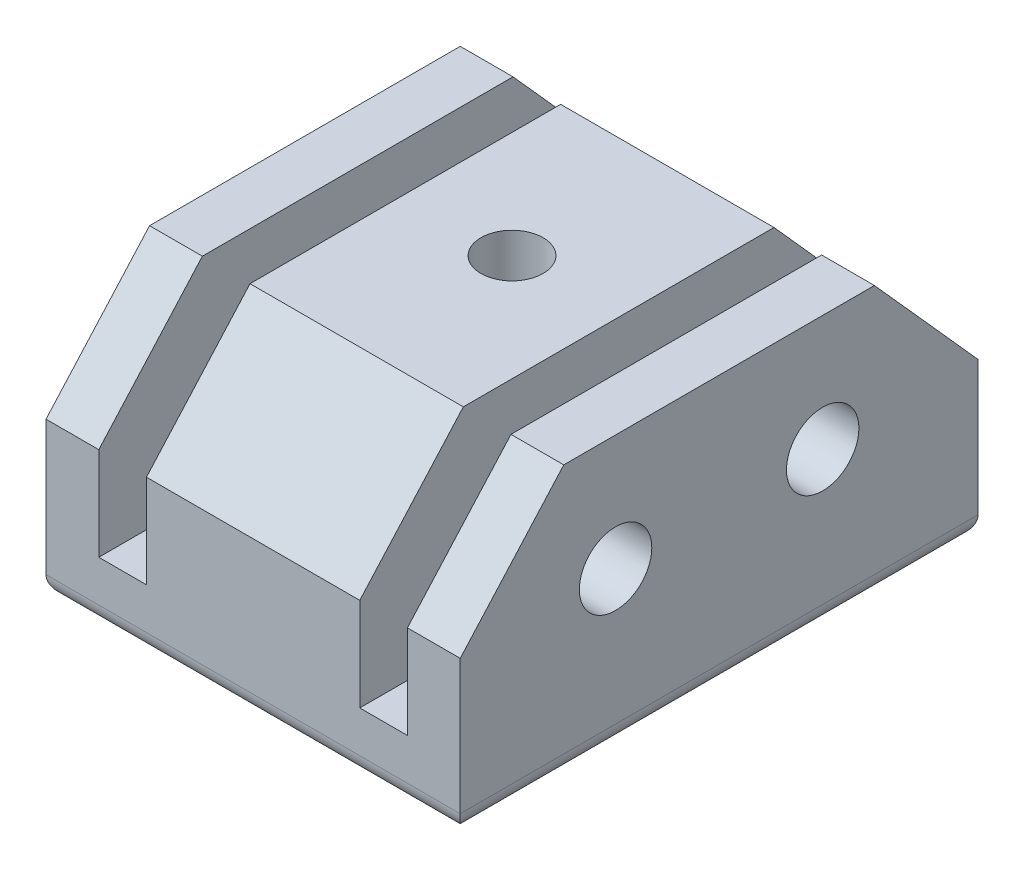
ISO-10303-21;
HEADER;
FILE_DESCRIPTION(('STEP AP214'),'2;1');
FILE_NAME('part.step','',(''),(''),'','','');
FILE_SCHEMA(('AUTOMOTIVE_DESIGN { 1 0 10303 214 1 1 1 1 }'));
ENDSEC;
DATA;
#1=APPLICATION_CONTEXT('core data for automotive mechanical design processes');
#2=APPLICATION_PROTOCOL_DEFINITION('international standard','automotive_design',2000,#1);
#3=PRODUCT_CONTEXT('',#1,'mechanical');
#4=PRODUCT('Part','Part','',(#3));
#5=PRODUCT_RELATED_PRODUCT_CATEGORY('part','',(#4));
#6=PRODUCT_DEFINITION_FORMATION('','',#4);
#7=PRODUCT_DEFINITION_CONTEXT('part definition',#1,'design');
#8=PRODUCT_DEFINITION('design','',#6,#7);
#9=PRODUCT_DEFINITION_SHAPE('','',#8);
#10=(LENGTH_UNIT() NAMED_UNIT(*) SI_UNIT(.MILLI.,.METRE.));
#11=(NAMED_UNIT(*) PLANE_ANGLE_UNIT() SI_UNIT($,.RADIAN.));
#12=(NAMED_UNIT(*) SI_UNIT($,.STERADIAN.) SOLID_ANGLE_UNIT());
#13=UNCERTAINTY_MEASURE_WITH_UNIT(LENGTH_MEASURE(1.E-05),#10,'distance_accuracy_value','');
#14=(GEOMETRIC_REPRESENTATION_CONTEXT(3) GLOBAL_UNCERTAINTY_ASSIGNED_CONTEXT((#13)) GLOBAL_UNIT_ASSIGNED_CONTEXT((#10,
#11,#12)) REPRESENTATION_CONTEXT('',''));
#15=CARTESIAN_POINT('',(0.,0.,0.));
#16=DIRECTION('',(0.,0.,1.));
#17=DIRECTION('',(1.,0.,0.));
#18=AXIS2_PLACEMENT_3D('',#15,#16,#17);
#19=CARTESIAN_POINT('',(-25.4,33.2490316571237,-31.75));
#20=DIRECTION('',(0.,-1.,0.));
#21=DIRECTION('',(0.,0.,-1.));
#22=AXIS2_PLACEMENT_3D('',#19,#20,#21);
#23=CYLINDRICAL_SURFACE('',#22,3.81);
#24=CARTESIAN_POINT('',(-25.4,33.2490316571237,-31.75));
#25=DIRECTION('',(0.,-1.,0.));
#26=DIRECTION('',(0.,0.,-1.));
#27=AXIS2_PLACEMENT_3D('',#24,#25,#26);
#28=CIRCLE('',#27,3.81);
#29=CARTESIAN_POINT('',(-25.4,33.2490316571237,-35.56));
#30=VERTEX_POINT('',#29);
#31=EDGE_CURVE('E272',#30,#30,#28,.T.);
#32=ORIENTED_EDGE('',*,*,#31,.F.);
#33=EDGE_LOOP('',(#32));
#34=FACE_BOUND('',#33,.T.);
#35=CARTESIAN_POINT('',(-25.4,6.35,-31.75));
#36=DIRECTION('',(0.,-1.,0.));
#37=DIRECTION('',(0.,0.,-1.));
#38=AXIS2_PLACEMENT_3D('',#35,#36,#37);
#39=CIRCLE('',#38,3.81);
#40=CARTESIAN_POINT('',(-25.4,6.35,-35.56));
#41=VERTEX_POINT('',#40);
#42=EDGE_CURVE('E47',#41,#41,#39,.F.);
#43=ORIENTED_EDGE('',*,*,#42,.F.);
#44=EDGE_LOOP('',(#43));
#45=FACE_BOUND('',#44,.T.);
#46=ADVANCED_FACE('F43',(#34,#45),#23,.F.);
#47=CARTESIAN_POINT('',(-50.8,19.05,0.));
#48=DIRECTION('',(0.,0.666666666666667,0.74535599249993));
#49=DIRECTION('',(0.,-0.74535599249993,0.666666666666667));
#50=AXIS2_PLACEMENT_3D('',#47,#48,#49);
#51=PLANE('',#50);
#52=DIRECTION('',(0.,-0.74535599249993,0.666666666666667));
#53=VECTOR('',#52,1.);
#54=CARTESIAN_POINT('',(-44.323,19.05,0.));
#55=LINE('',#54,#53);
#56=CARTESIAN_POINT('',(-44.323,33.2490316571237,-12.7));
#57=VERTEX_POINT('',#56);
#58=CARTESIAN_POINT('',(-44.323,19.05,0.));
#59=VERTEX_POINT('',#58);
#60=EDGE_CURVE('E367',#57,#59,#55,.T.);
#61=ORIENTED_EDGE('',*,*,#60,.F.);
#62=DIRECTION('',(1.,0.,0.));
#63=VECTOR('',#62,1.);
#64=CARTESIAN_POINT('',(-50.8,33.2490316571237,-12.7));
#65=LINE('',#64,#63);
#66=CARTESIAN_POINT('',(-50.8,33.2490316571237,-12.7));
#67=VERTEX_POINT('',#66);
#68=EDGE_CURVE('E394',#67,#57,#65,.T.);
#69=ORIENTED_EDGE('',*,*,#68,.F.);
#70=DIRECTION('',(0.,-0.74535599249993,0.666666666666667));
#71=VECTOR('',#70,1.);
#72=CARTESIAN_POINT('',(-50.8,19.05,0.));
#73=LINE('',#72,#71);
#74=CARTESIAN_POINT('',(-50.8,19.05,0.));
#75=VERTEX_POINT('',#74);
#76=EDGE_CURVE('E377',#67,#75,#73,.T.);
#77=ORIENTED_EDGE('',*,*,#76,.T.);
#78=DIRECTION('',(1.,0.,0.));
#79=VECTOR('',#78,1.);
#80=CARTESIAN_POINT('',(-50.8,19.05,0.));
#81=LINE('',#80,#79);
#82=EDGE_CURVE('E388',#75,#59,#81,.T.);
#83=ORIENTED_EDGE('',*,*,#82,.T.);
#84=EDGE_LOOP('',(#61,#69,#77,#83));
#85=FACE_BOUND('',#84,.T.);
#86=ADVANCED_FACE('F512',(#85),#51,.T.);
#87=DIRECTION('',(0.,0.74535599249993,-0.666666666666667));
#88=VECTOR('',#87,1.);
#89=CARTESIAN_POINT('',(-6.477,19.05,0.));
#90=LINE('',#89,#88);
#91=CARTESIAN_POINT('',(-6.477,19.05,0.));
#92=VERTEX_POINT('',#91);
#93=CARTESIAN_POINT('',(-6.477,33.2490316571237,-12.7));
#94=VERTEX_POINT('',#93);
#95=EDGE_CURVE('E363',#92,#94,#90,.T.);
#96=ORIENTED_EDGE('',*,*,#95,.F.);
#97=CARTESIAN_POINT('',(0.,19.05,0.));
#98=VERTEX_POINT('',#97);
#99=EDGE_CURVE('E393',#92,#98,#81,.T.);
#100=ORIENTED_EDGE('',*,*,#99,.T.);
#101=DIRECTION('',(0.,-0.74535599249993,0.666666666666667));
#102=VECTOR('',#101,1.);
#103=CARTESIAN_POINT('',(0.,19.05,0.));
#104=LINE('',#103,#102);
#105=CARTESIAN_POINT('',(0.,33.2490316571237,-12.7));
#106=VERTEX_POINT('',#105);
#107=EDGE_CURVE('E374',#106,#98,#104,.T.);
#108=ORIENTED_EDGE('',*,*,#107,.F.);
#109=EDGE_CURVE('E398',#94,#106,#65,.T.);
#110=ORIENTED_EDGE('',*,*,#109,.F.);
#111=EDGE_LOOP('',(#96,#100,#108,#110));
#112=FACE_BOUND('',#111,.T.);
#113=ADVANCED_FACE('F491',(#112),#51,.T.);
#114=CARTESIAN_POINT('',(-50.8,33.2490316571237,-12.7));
#115=DIRECTION('',(0.,1.,0.));
#116=DIRECTION('',(0.,0.,1.));
#117=AXIS2_PLACEMENT_3D('',#114,#115,#116);
#118=PLANE('',#117);
#119=DIRECTION('',(0.,0.,-1.));
#120=VECTOR('',#119,1.);
#121=CARTESIAN_POINT('',(-44.323,33.2490316571237,0.));
#122=LINE('',#121,#120);
#123=CARTESIAN_POINT('',(-44.323,33.2490316571237,-50.8));
#124=VERTEX_POINT('',#123);
#125=EDGE_CURVE('E320',#57,#124,#122,.T.);
#126=ORIENTED_EDGE('',*,*,#125,.T.);
#127=DIRECTION('',(1.,0.,0.));
#128=VECTOR('',#127,1.);
#129=CARTESIAN_POINT('',(-50.8,33.2490316571237,-50.8));
#130=LINE('',#129,#128);
#131=CARTESIAN_POINT('',(-50.8,33.2490316571237,-50.8));
#132=VERTEX_POINT('',#131);
#133=EDGE_CURVE('E399',#132,#124,#130,.T.);
#134=ORIENTED_EDGE('',*,*,#133,.F.);
#135=DIRECTION('',(0.,0.,1.));
#136=VECTOR('',#135,1.);
#137=CARTESIAN_POINT('',(-50.8,33.2490316571237,-12.7));
#138=LINE('',#137,#136);
#139=EDGE_CURVE('E373',#132,#67,#138,.T.);
#140=ORIENTED_EDGE('',*,*,#139,.T.);
#141=ORIENTED_EDGE('',*,*,#68,.T.);
#142=EDGE_LOOP('',(#126,#134,#140,#141));
#143=FACE_BOUND('',#142,.T.);
#144=ADVANCED_FACE('F510',(#143),#118,.T.);
#145=DIRECTION('',(0.,0.,-1.));
#146=VECTOR('',#145,1.);
#147=CARTESIAN_POINT('',(-6.477,33.2490316571237,0.));
#148=LINE('',#147,#146);
#149=CARTESIAN_POINT('',(-6.477,33.2490316571237,-50.8));
#150=VERTEX_POINT('',#149);
#151=EDGE_CURVE('E324',#94,#150,#148,.T.);
#152=ORIENTED_EDGE('',*,*,#151,.F.);
#153=ORIENTED_EDGE('',*,*,#109,.T.);
#154=DIRECTION('',(0.,0.,1.));
#155=VECTOR('',#154,1.);
#156=CARTESIAN_POINT('',(0.,33.2490316571237,-12.7));
#157=LINE('',#156,#155);
#158=CARTESIAN_POINT('',(0.,33.2490316571237,-50.8));
#159=VERTEX_POINT('',#158);
#160=EDGE_CURVE('E383',#159,#106,#157,.T.);
#161=ORIENTED_EDGE('',*,*,#160,.F.);
#162=EDGE_CURVE('E403',#150,#159,#130,.T.);
#163=ORIENTED_EDGE('',*,*,#162,.F.);
#164=EDGE_LOOP('',(#152,#153,#161,#163));
#165=FACE_BOUND('',#164,.T.);
#166=ADVANCED_FACE('F487',(#165),#118,.T.);
#167=CARTESIAN_POINT('',(-50.8,33.2490316571237,-50.8));
#168=DIRECTION('',(0.,0.666666666666666,-0.74535599249993));
#169=DIRECTION('',(0.,0.74535599249993,0.666666666666666));
#170=AXIS2_PLACEMENT_3D('',#167,#168,#169);
#171=PLANE('',#170);
#172=DIRECTION('',(0.,0.74535599249993,0.666666666666666));
#173=VECTOR('',#172,1.);
#174=CARTESIAN_POINT('',(-44.323,33.2490316571237,-50.8));
#175=LINE('',#174,#173);
#176=CARTESIAN_POINT('',(-44.323,19.05,-63.5));
#177=VERTEX_POINT('',#176);
#178=EDGE_CURVE('E423',#177,#124,#175,.T.);
#179=ORIENTED_EDGE('',*,*,#178,.F.);
#180=DIRECTION('',(1.,0.,0.));
#181=VECTOR('',#180,1.);
#182=CARTESIAN_POINT('',(-50.8,19.05,-63.5));
#183=LINE('',#182,#181);
#184=CARTESIAN_POINT('',(-50.8,19.05,-63.5));
#185=VERTEX_POINT('',#184);
#186=EDGE_CURVE('E404',#185,#177,#183,.T.);
#187=ORIENTED_EDGE('',*,*,#186,.F.);
#188=DIRECTION('',(0.,0.74535599249993,0.666666666666666));
#189=VECTOR('',#188,1.);
#190=CARTESIAN_POINT('',(-50.8,33.2490316571237,-50.8));
#191=LINE('',#190,#189);
#192=EDGE_CURVE('E370',#185,#132,#191,.T.);
#193=ORIENTED_EDGE('',*,*,#192,.T.);
#194=ORIENTED_EDGE('',*,*,#133,.T.);
#195=EDGE_LOOP('',(#179,#187,#193,#194));
#196=FACE_BOUND('',#195,.T.);
#197=ADVANCED_FACE('F505',(#196),#171,.T.);
#198=DIRECTION('',(0.,-0.74535599249993,-0.666666666666666));
#199=VECTOR('',#198,1.);
#200=CARTESIAN_POINT('',(-6.477,33.2490316571237,-50.8));
#201=LINE('',#200,#199);
#202=CARTESIAN_POINT('',(-6.477,19.05,-63.5));
#203=VERTEX_POINT('',#202);
#204=EDGE_CURVE('E419',#150,#203,#201,.T.);
#205=ORIENTED_EDGE('',*,*,#204,.F.);
#206=ORIENTED_EDGE('',*,*,#162,.T.);
#207=DIRECTION('',(0.,0.74535599249993,0.666666666666666));
#208=VECTOR('',#207,1.);
#209=CARTESIAN_POINT('',(0.,33.2490316571237,-50.8));
#210=LINE('',#209,#208);
#211=CARTESIAN_POINT('',(0.,19.05,-63.5));
#212=VERTEX_POINT('',#211);
#213=EDGE_CURVE('E369',#212,#159,#210,.T.);
#214=ORIENTED_EDGE('',*,*,#213,.F.);
#215=EDGE_CURVE('E380',#203,#212,#183,.T.);
#216=ORIENTED_EDGE('',*,*,#215,.F.);
#217=EDGE_LOOP('',(#205,#206,#214,#216));
#218=FACE_BOUND('',#217,.T.);
#219=ADVANCED_FACE('F481',(#218),#171,.T.);
#220=CARTESIAN_POINT('',(-50.8,0.,0.));
#221=DIRECTION('',(0.,0.,1.));
#222=DIRECTION('',(1.,0.,0.));
#223=AXIS2_PLACEMENT_3D('',#220,#221,#222);
#224=PLANE('',#223);
#225=DIRECTION('',(0.,-1.,0.));
#226=VECTOR('',#225,1.);
#227=CARTESIAN_POINT('',(-50.8,0.,0.));
#228=LINE('',#227,#226);
#229=CARTESIAN_POINT('',(-50.8,2.54,0.));
#230=VERTEX_POINT('',#229);
#231=EDGE_CURVE('E408',#75,#230,#228,.T.);
#232=ORIENTED_EDGE('',*,*,#231,.T.);
#233=DIRECTION('',(1.,0.,0.));
#234=VECTOR('',#233,1.);
#235=CARTESIAN_POINT('',(-50.8,2.54,0.));
#236=LINE('',#235,#234);
#237=CARTESIAN_POINT('',(0.,2.54,0.));
#238=VERTEX_POINT('',#237);
#239=EDGE_CURVE('E52',#230,#238,#236,.T.);
#240=ORIENTED_EDGE('',*,*,#239,.T.);
#241=DIRECTION('',(0.,-1.,0.));
#242=VECTOR('',#241,1.);
#243=CARTESIAN_POINT('',(0.,0.,0.));
#244=LINE('',#243,#242);
#245=EDGE_CURVE('E391',#98,#238,#244,.T.);
#246=ORIENTED_EDGE('',*,*,#245,.F.);
#247=ORIENTED_EDGE('',*,*,#99,.F.);
#248=DIRECTION('',(0.,-1.,0.));
#249=VECTOR('',#248,1.);
#250=CARTESIAN_POINT('',(-6.477,7.61999999999999,0.));
#251=LINE('',#250,#249);
#252=CARTESIAN_POINT('',(-6.477,7.61999999999999,0.));
#253=VERTEX_POINT('',#252);
#254=EDGE_CURVE('E338',#92,#253,#251,.T.);
#255=ORIENTED_EDGE('',*,*,#254,.T.);
#256=DIRECTION('',(-1.,0.,0.));
#257=VECTOR('',#256,1.);
#258=CARTESIAN_POINT('',(-12.319,7.61999999999999,0.));
#259=LINE('',#258,#257);
#260=CARTESIAN_POINT('',(-12.319,7.61999999999999,0.));
#261=VERTEX_POINT('',#260);
#262=EDGE_CURVE('E341',#253,#261,#259,.T.);
#263=ORIENTED_EDGE('',*,*,#262,.T.);
#264=DIRECTION('',(0.,1.,0.));
#265=VECTOR('',#264,1.);
#266=CARTESIAN_POINT('',(-12.319,7.61999999999999,0.));
#267=LINE('',#266,#265);
#268=CARTESIAN_POINT('',(-12.319,19.05,0.));
#269=VERTEX_POINT('',#268);
#270=EDGE_CURVE('E345',#261,#269,#267,.T.);
#271=ORIENTED_EDGE('',*,*,#270,.T.);
#272=CARTESIAN_POINT('',(-38.481,19.05,0.));
#273=VERTEX_POINT('',#272);
#274=EDGE_CURVE('E392',#273,#269,#81,.T.);
#275=ORIENTED_EDGE('',*,*,#274,.F.);
#276=DIRECTION('',(0.,-1.,0.));
#277=VECTOR('',#276,1.);
#278=CARTESIAN_POINT('',(-38.481,7.61999999999999,0.));
#279=LINE('',#278,#277);
#280=CARTESIAN_POINT('',(-38.481,7.61999999999999,0.));
#281=VERTEX_POINT('',#280);
#282=EDGE_CURVE('E313',#273,#281,#279,.T.);
#283=ORIENTED_EDGE('',*,*,#282,.T.);
#284=DIRECTION('',(-1.,0.,0.));
#285=VECTOR('',#284,1.);
#286=CARTESIAN_POINT('',(-38.481,7.61999999999999,0.));
#287=LINE('',#286,#285);
#288=CARTESIAN_POINT('',(-44.323,7.61999999999999,0.));
#289=VERTEX_POINT('',#288);
#290=EDGE_CURVE('E317',#281,#289,#287,.T.);
#291=ORIENTED_EDGE('',*,*,#290,.T.);
#292=DIRECTION('',(0.,1.,0.));
#293=VECTOR('',#292,1.);
#294=CARTESIAN_POINT('',(-44.323,7.61999999999999,0.));
#295=LINE('',#294,#293);
#296=EDGE_CURVE('E310',#289,#59,#295,.T.);
#297=ORIENTED_EDGE('',*,*,#296,.T.);
#298=ORIENTED_EDGE('',*,*,#82,.F.);
#299=EDGE_LOOP('',(#232,#240,#246,#247,#255,#263,#271,#275,#283,#291,#297,#298));
#300=FACE_BOUND('',#299,.T.);
#301=ADVANCED_FACE('F494',(#300),#224,.T.);
#302=CARTESIAN_POINT('',(-50.8,0.,-63.5));
#303=DIRECTION('',(0.,0.,-1.));
#304=DIRECTION('',(-1.,0.,0.));
#305=AXIS2_PLACEMENT_3D('',#302,#303,#304);
#306=PLANE('',#305);
#307=DIRECTION('',(0.,1.,0.));
#308=VECTOR('',#307,1.);
#309=CARTESIAN_POINT('',(0.,0.,-63.5));
#310=LINE('',#309,#308);
#311=CARTESIAN_POINT('',(0.,2.54,-63.5));
#312=VERTEX_POINT('',#311);
#313=EDGE_CURVE('E412',#312,#212,#310,.T.);
#314=ORIENTED_EDGE('',*,*,#313,.F.);
#315=DIRECTION('',(1.,0.,0.));
#316=VECTOR('',#315,1.);
#317=CARTESIAN_POINT('',(-50.8,2.54,-63.5));
#318=LINE('',#317,#316);
#319=CARTESIAN_POINT('',(-50.8,2.54,-63.5));
#320=VERTEX_POINT('',#319);
#321=EDGE_CURVE('E12',#312,#320,#318,.F.);
#322=ORIENTED_EDGE('',*,*,#321,.T.);
#323=DIRECTION('',(0.,1.,0.));
#324=VECTOR('',#323,1.);
#325=CARTESIAN_POINT('',(-50.8,0.,-63.5));
#326=LINE('',#325,#324);
#327=EDGE_CURVE('E411',#320,#185,#326,.T.);
#328=ORIENTED_EDGE('',*,*,#327,.T.);
#329=ORIENTED_EDGE('',*,*,#186,.T.);
#330=DIRECTION('',(0.,1.,0.));
#331=VECTOR('',#330,1.);
#332=CARTESIAN_POINT('',(-44.323,7.61999999999999,-63.5));
#333=LINE('',#332,#331);
#334=CARTESIAN_POINT('',(-44.323,7.61999999999999,-63.5));
#335=VERTEX_POINT('',#334);
#336=EDGE_CURVE('E321',#335,#177,#333,.T.);
#337=ORIENTED_EDGE('',*,*,#336,.F.);
#338=DIRECTION('',(-1.,0.,0.));
#339=VECTOR('',#338,1.);
#340=CARTESIAN_POINT('',(-38.481,7.61999999999999,-63.5));
#341=LINE('',#340,#339);
#342=CARTESIAN_POINT('',(-38.481,7.61999999999999,-63.5));
#343=VERTEX_POINT('',#342);
#344=EDGE_CURVE('E314',#343,#335,#341,.T.);
#345=ORIENTED_EDGE('',*,*,#344,.F.);
#346=DIRECTION('',(0.,-1.,0.));
#347=VECTOR('',#346,1.);
#348=CARTESIAN_POINT('',(-38.481,7.61999999999999,-63.5));
#349=LINE('',#348,#347);
#350=CARTESIAN_POINT('',(-38.481,19.05,-63.5));
#351=VERTEX_POINT('',#350);
#352=EDGE_CURVE('E323',#351,#343,#349,.T.);
#353=ORIENTED_EDGE('',*,*,#352,.F.);
#354=CARTESIAN_POINT('',(-12.319,19.05,-63.5));
#355=VERTEX_POINT('',#354);
#356=EDGE_CURVE('E407',#351,#355,#183,.T.);
#357=ORIENTED_EDGE('',*,*,#356,.T.);
#358=DIRECTION('',(0.,1.,0.));
#359=VECTOR('',#358,1.);
#360=CARTESIAN_POINT('',(-12.319,7.61999999999999,-63.5));
#361=LINE('',#360,#359);
#362=CARTESIAN_POINT('',(-12.319,7.61999999999999,-63.5));
#363=VERTEX_POINT('',#362);
#364=EDGE_CURVE('E342',#363,#355,#361,.T.);
#365=ORIENTED_EDGE('',*,*,#364,.F.);
#366=DIRECTION('',(-1.,0.,0.));
#367=VECTOR('',#366,1.);
#368=CARTESIAN_POINT('',(-12.319,7.61999999999999,-63.5));
#369=LINE('',#368,#367);
#370=CARTESIAN_POINT('',(-6.477,7.61999999999999,-63.5));
#371=VERTEX_POINT('',#370);
#372=EDGE_CURVE('E350',#371,#363,#369,.T.);
#373=ORIENTED_EDGE('',*,*,#372,.F.);
#374=DIRECTION('',(0.,-1.,0.));
#375=VECTOR('',#374,1.);
#376=CARTESIAN_POINT('',(-6.477,7.61999999999999,-63.5));
#377=LINE('',#376,#375);
#378=EDGE_CURVE('E309',#203,#371,#377,.T.);
#379=ORIENTED_EDGE('',*,*,#378,.F.);
#380=ORIENTED_EDGE('',*,*,#215,.T.);
#381=EDGE_LOOP('',(#314,#322,#328,#329,#337,#345,#353,#357,#365,#373,#379,#380));
#382=FACE_BOUND('',#381,.T.);
#383=ADVANCED_FACE('F474',(#382),#306,.T.);
#384=CARTESIAN_POINT('',(-50.8,0.,0.));
#385=DIRECTION('',(0.,-1.,0.));
#386=DIRECTION('',(0.,0.,-1.));
#387=AXIS2_PLACEMENT_3D('',#384,#385,#386);
#388=PLANE('',#387);
#389=DIRECTION('',(-1.,0.,0.));
#390=VECTOR('',#389,1.);
#391=CARTESIAN_POINT('',(-21.4405318538975,0.,-24.892));
#392=LINE('',#391,#390);
#393=CARTESIAN_POINT('',(-21.4405318538975,0.,-24.892));
#394=VERTEX_POINT('',#393);
#395=CARTESIAN_POINT('',(-29.3594681461025,0.,-24.892));
#396=VERTEX_POINT('',#395);
#397=EDGE_CURVE('E60',#394,#396,#392,.T.);
#398=ORIENTED_EDGE('',*,*,#397,.F.);
#399=DIRECTION('',(-0.5,0.,0.866025403784439));
#400=VECTOR('',#399,1.);
#401=CARTESIAN_POINT('',(-17.4810637077951,0.,-31.75));
#402=LINE('',#401,#400);
#403=CARTESIAN_POINT('',(-17.4810637077951,0.,-31.75));
#404=VERTEX_POINT('',#403);
#405=EDGE_CURVE('E239',#404,#394,#402,.T.);
#406=ORIENTED_EDGE('',*,*,#405,.F.);
#407=DIRECTION('',(0.5,0.,0.866025403784438));
#408=VECTOR('',#407,1.);
#409=CARTESIAN_POINT('',(-21.4405318538975,0.,-38.608));
#410=LINE('',#409,#408);
#411=CARTESIAN_POINT('',(-21.4405318538975,0.,-38.608));
#412=VERTEX_POINT('',#411);
#413=EDGE_CURVE('E242',#412,#404,#410,.T.);
#414=ORIENTED_EDGE('',*,*,#413,.F.);
#415=DIRECTION('',(1.,0.,0.));
#416=VECTOR('',#415,1.);
#417=CARTESIAN_POINT('',(-29.3594681461025,0.,-38.608));
#418=LINE('',#417,#416);
#419=CARTESIAN_POINT('',(-29.3594681461025,0.,-38.608));
#420=VERTEX_POINT('',#419);
#421=EDGE_CURVE('E258',#420,#412,#418,.T.);
#422=ORIENTED_EDGE('',*,*,#421,.F.);
#423=DIRECTION('',(0.5,0.,-0.866025403784439));
#424=VECTOR('',#423,1.);
#425=CARTESIAN_POINT('',(-33.3189362922049,0.,-31.75));
#426=LINE('',#425,#424);
#427=CARTESIAN_POINT('',(-33.3189362922049,0.,-31.75));
#428=VERTEX_POINT('',#427);
#429=EDGE_CURVE('E255',#428,#420,#426,.T.);
#430=ORIENTED_EDGE('',*,*,#429,.F.);
#431=DIRECTION('',(-0.5,0.,-0.866025403784439));
#432=VECTOR('',#431,1.);
#433=CARTESIAN_POINT('',(-29.3594681461025,0.,-24.892));
#434=LINE('',#433,#432);
#435=EDGE_CURVE('E253',#396,#428,#434,.T.);
#436=ORIENTED_EDGE('',*,*,#435,.F.);
#437=EDGE_LOOP('',(#398,#406,#414,#422,#430,#436));
#438=FACE_BOUND('',#437,.T.);
#439=DIRECTION('',(0.,0.,-1.));
#440=VECTOR('',#439,1.);
#441=CARTESIAN_POINT('',(-2.54,0.,0.));
#442=LINE('',#441,#440);
#443=CARTESIAN_POINT('',(-2.54,0.,-60.96));
#444=VERTEX_POINT('',#443);
#445=CARTESIAN_POINT('',(-2.54,0.,-2.54));
#446=VERTEX_POINT('',#445);
#447=EDGE_CURVE('E436',#444,#446,#442,.F.);
#448=ORIENTED_EDGE('',*,*,#447,.T.);
#449=DIRECTION('',(1.,0.,0.));
#450=VECTOR('',#449,1.);
#451=CARTESIAN_POINT('',(-50.8,0.,-2.54));
#452=LINE('',#451,#450);
#453=CARTESIAN_POINT('',(-48.26,0.,-2.54));
#454=VERTEX_POINT('',#453);
#455=EDGE_CURVE('E439',#446,#454,#452,.F.);
#456=ORIENTED_EDGE('',*,*,#455,.T.);
#457=DIRECTION('',(0.,0.,-1.));
#458=VECTOR('',#457,1.);
#459=CARTESIAN_POINT('',(-48.26,0.,0.));
#460=LINE('',#459,#458);
#461=CARTESIAN_POINT('',(-48.26,0.,-60.96));
#462=VERTEX_POINT('',#461);
#463=EDGE_CURVE('E434',#454,#462,#460,.T.);
#464=ORIENTED_EDGE('',*,*,#463,.T.);
#465=DIRECTION('',(1.,0.,0.));
#466=VECTOR('',#465,1.);
#467=CARTESIAN_POINT('',(-50.8,0.,-60.96));
#468=LINE('',#467,#466);
#469=EDGE_CURVE('E432',#462,#444,#468,.T.);
#470=ORIENTED_EDGE('',*,*,#469,.T.);
#471=EDGE_LOOP('',(#448,#456,#464,#470));
#472=FACE_BOUND('',#471,.T.);
#473=ADVANCED_FACE('F462',(#438,#472),#388,.T.);
#474=CARTESIAN_POINT('',(-50.8,0.,0.));
#475=DIRECTION('',(-1.,0.,0.));
#476=DIRECTION('',(0.,0.,1.));
#477=AXIS2_PLACEMENT_3D('',#474,#475,#476);
#478=PLANE('',#477);
#479=CARTESIAN_POINT('',(-50.8,19.05,-19.05));
#480=DIRECTION('',(1.,0.,0.));
#481=DIRECTION('',(0.,0.,-1.));
#482=AXIS2_PLACEMENT_3D('',#479,#480,#481);
#483=CIRCLE('',#482,4.445);
#484=CARTESIAN_POINT('',(-50.8,19.05,-23.495));
#485=VERTEX_POINT('',#484);
#486=EDGE_CURVE('E276',#485,#485,#483,.T.);
#487=ORIENTED_EDGE('',*,*,#486,.T.);
#488=EDGE_LOOP('',(#487));
#489=FACE_BOUND('',#488,.T.);
#490=CARTESIAN_POINT('',(-50.8,19.05,-44.45));
#491=DIRECTION('',(1.,0.,0.));
#492=DIRECTION('',(0.,0.,-1.));
#493=AXIS2_PLACEMENT_3D('',#490,#491,#492);
#494=CIRCLE('',#493,4.44499999999999);
#495=CARTESIAN_POINT('',(-50.8,19.05,-48.895));
#496=VERTEX_POINT('',#495);
#497=EDGE_CURVE('E283',#496,#496,#494,.T.);
#498=ORIENTED_EDGE('',*,*,#497,.T.);
#499=EDGE_LOOP('',(#498));
#500=FACE_BOUND('',#499,.T.);
#501=ORIENTED_EDGE('',*,*,#327,.F.);
#502=DIRECTION('',(0.,0.,-1.));
#503=VECTOR('',#502,1.);
#504=CARTESIAN_POINT('',(-50.8,2.54,0.));
#505=LINE('',#504,#503);
#506=EDGE_CURVE('E441',#320,#230,#505,.F.);
#507=ORIENTED_EDGE('',*,*,#506,.T.);
#508=ORIENTED_EDGE('',*,*,#231,.F.);
#509=ORIENTED_EDGE('',*,*,#76,.F.);
#510=ORIENTED_EDGE('',*,*,#139,.F.);
#511=ORIENTED_EDGE('',*,*,#192,.F.);
#512=EDGE_LOOP('',(#501,#507,#508,#509,#510,#511));
#513=FACE_BOUND('',#512,.T.);
#514=ADVANCED_FACE('F498',(#489,#500,#513),#478,.T.);
#515=CARTESIAN_POINT('',(0.,0.,0.));
#516=DIRECTION('',(-1.,0.,0.));
#517=DIRECTION('',(0.,0.,1.));
#518=AXIS2_PLACEMENT_3D('',#515,#516,#517);
#519=PLANE('',#518);
#520=CARTESIAN_POINT('',(0.,19.05,-19.05));
#521=DIRECTION('',(1.,0.,0.));
#522=DIRECTION('',(0.,0.,-1.));
#523=AXIS2_PLACEMENT_3D('',#520,#521,#522);
#524=CIRCLE('',#523,4.445);
#525=CARTESIAN_POINT('',(0.,19.05,-23.495));
#526=VERTEX_POINT('',#525);
#527=EDGE_CURVE('E280',#526,#526,#524,.T.);
#528=ORIENTED_EDGE('',*,*,#527,.F.);
#529=EDGE_LOOP('',(#528));
#530=FACE_BOUND('',#529,.T.);
#531=CARTESIAN_POINT('',(0.,19.05,-44.45));
#532=DIRECTION('',(1.,0.,0.));
#533=DIRECTION('',(0.,0.,-1.));
#534=AXIS2_PLACEMENT_3D('',#531,#532,#533);
#535=CIRCLE('',#534,4.44499999999999);
#536=CARTESIAN_POINT('',(0.,19.05,-48.895));
#537=VERTEX_POINT('',#536);
#538=EDGE_CURVE('E286',#537,#537,#535,.T.);
#539=ORIENTED_EDGE('',*,*,#538,.F.);
#540=EDGE_LOOP('',(#539));
#541=FACE_BOUND('',#540,.T.);
#542=ORIENTED_EDGE('',*,*,#245,.T.);
#543=DIRECTION('',(0.,0.,-1.));
#544=VECTOR('',#543,1.);
#545=CARTESIAN_POINT('',(0.,2.54,-63.5));
#546=LINE('',#545,#544);
#547=EDGE_CURVE('E425',#238,#312,#546,.T.);
#548=ORIENTED_EDGE('',*,*,#547,.T.);
#549=ORIENTED_EDGE('',*,*,#313,.T.);
#550=ORIENTED_EDGE('',*,*,#213,.T.);
#551=ORIENTED_EDGE('',*,*,#160,.T.);
#552=ORIENTED_EDGE('',*,*,#107,.T.);
#553=EDGE_LOOP('',(#542,#548,#549,#550,#551,#552));
#554=FACE_BOUND('',#553,.T.);
#555=ADVANCED_FACE('F471',(#530,#541,#554),#519,.F.);
#556=DIRECTION('',(0.,0.74535599249993,-0.666666666666667));
#557=VECTOR('',#556,1.);
#558=CARTESIAN_POINT('',(-38.481,19.05,0.));
#559=LINE('',#558,#557);
#560=CARTESIAN_POINT('',(-38.481,33.2490316571237,-12.7));
#561=VERTEX_POINT('',#560);
#562=EDGE_CURVE('E365',#273,#561,#559,.T.);
#563=ORIENTED_EDGE('',*,*,#562,.F.);
#564=ORIENTED_EDGE('',*,*,#274,.T.);
#565=DIRECTION('',(0.,-0.74535599249993,0.666666666666667));
#566=VECTOR('',#565,1.);
#567=CARTESIAN_POINT('',(-12.319,19.05,0.));
#568=LINE('',#567,#566);
#569=CARTESIAN_POINT('',(-12.319,33.2490316571237,-12.7));
#570=VERTEX_POINT('',#569);
#571=EDGE_CURVE('E330',#570,#269,#568,.T.);
#572=ORIENTED_EDGE('',*,*,#571,.F.);
#573=EDGE_CURVE('E397',#561,#570,#65,.T.);
#574=ORIENTED_EDGE('',*,*,#573,.F.);
#575=EDGE_LOOP('',(#563,#564,#572,#574));
#576=FACE_BOUND('',#575,.T.);
#577=ADVANCED_FACE('F540',(#576),#51,.T.);
#578=ORIENTED_EDGE('',*,*,#31,.T.);
#579=EDGE_LOOP('',(#578));
#580=FACE_BOUND('',#579,.T.);
#581=DIRECTION('',(0.,0.,-1.));
#582=VECTOR('',#581,1.);
#583=CARTESIAN_POINT('',(-38.481,33.2490316571237,0.));
#584=LINE('',#583,#582);
#585=CARTESIAN_POINT('',(-38.481,33.2490316571237,-50.8));
#586=VERTEX_POINT('',#585);
#587=EDGE_CURVE('E334',#561,#586,#584,.T.);
#588=ORIENTED_EDGE('',*,*,#587,.F.);
#589=ORIENTED_EDGE('',*,*,#573,.T.);
#590=DIRECTION('',(0.,0.,-1.));
#591=VECTOR('',#590,1.);
#592=CARTESIAN_POINT('',(-12.319,33.2490316571237,0.));
#593=LINE('',#592,#591);
#594=CARTESIAN_POINT('',(-12.319,33.2490316571237,-50.8));
#595=VERTEX_POINT('',#594);
#596=EDGE_CURVE('E355',#570,#595,#593,.T.);
#597=ORIENTED_EDGE('',*,*,#596,.T.);
#598=EDGE_CURVE('E402',#586,#595,#130,.T.);
#599=ORIENTED_EDGE('',*,*,#598,.F.);
#600=EDGE_LOOP('',(#588,#589,#597,#599));
#601=FACE_BOUND('',#600,.T.);
#602=ADVANCED_FACE('F536',(#580,#601),#118,.T.);
#603=DIRECTION('',(0.,-0.74535599249993,-0.666666666666666));
#604=VECTOR('',#603,1.);
#605=CARTESIAN_POINT('',(-38.481,33.2490316571237,-50.8));
#606=LINE('',#605,#604);
#607=EDGE_CURVE('E421',#586,#351,#606,.T.);
#608=ORIENTED_EDGE('',*,*,#607,.F.);
#609=ORIENTED_EDGE('',*,*,#598,.T.);
#610=DIRECTION('',(0.,0.74535599249993,0.666666666666666));
#611=VECTOR('',#610,1.);
#612=CARTESIAN_POINT('',(-12.319,33.2490316571237,-50.8));
#613=LINE('',#612,#611);
#614=EDGE_CURVE('E414',#355,#595,#613,.T.);
#615=ORIENTED_EDGE('',*,*,#614,.F.);
#616=ORIENTED_EDGE('',*,*,#356,.F.);
#617=EDGE_LOOP('',(#608,#609,#615,#616));
#618=FACE_BOUND('',#617,.T.);
#619=ADVANCED_FACE('F527',(#618),#171,.T.);
#620=CARTESIAN_POINT('',(-6.477,7.61999999999999,0.));
#621=DIRECTION('',(1.,0.,0.));
#622=DIRECTION('',(0.,1.,0.));
#623=AXIS2_PLACEMENT_3D('',#620,#621,#622);
#624=PLANE('',#623);
#625=CARTESIAN_POINT('',(-6.477,19.05,-19.05));
#626=DIRECTION('',(1.,0.,0.));
#627=DIRECTION('',(0.,1.,0.));
#628=AXIS2_PLACEMENT_3D('',#625,#626,#627);
#629=CIRCLE('',#628,4.445);
#630=CARTESIAN_POINT('',(-6.477,23.495,-19.05));
#631=VERTEX_POINT('',#630);
#632=EDGE_CURVE('E306',#631,#631,#629,.T.);
#633=ORIENTED_EDGE('',*,*,#632,.T.);
#634=EDGE_LOOP('',(#633));
#635=FACE_BOUND('',#634,.T.);
#636=CARTESIAN_POINT('',(-6.477,19.05,-44.45));
#637=DIRECTION('',(1.,0.,0.));
#638=DIRECTION('',(0.,1.,0.));
#639=AXIS2_PLACEMENT_3D('',#636,#637,#638);
#640=CIRCLE('',#639,4.44499999999999);
#641=CARTESIAN_POINT('',(-6.477,23.495,-44.45));
#642=VERTEX_POINT('',#641);
#643=EDGE_CURVE('E296',#642,#642,#640,.T.);
#644=ORIENTED_EDGE('',*,*,#643,.T.);
#645=EDGE_LOOP('',(#644));
#646=FACE_BOUND('',#645,.T.);
#647=ORIENTED_EDGE('',*,*,#95,.T.);
#648=ORIENTED_EDGE('',*,*,#151,.T.);
#649=ORIENTED_EDGE('',*,*,#204,.T.);
#650=ORIENTED_EDGE('',*,*,#378,.T.);
#651=DIRECTION('',(0.,0.,-1.));
#652=VECTOR('',#651,1.);
#653=CARTESIAN_POINT('',(-6.477,7.61999999999999,0.));
#654=LINE('',#653,#652);
#655=EDGE_CURVE('E348',#253,#371,#654,.T.);
#656=ORIENTED_EDGE('',*,*,#655,.F.);
#657=ORIENTED_EDGE('',*,*,#254,.F.);
#658=EDGE_LOOP('',(#647,#648,#649,#650,#656,#657));
#659=FACE_BOUND('',#658,.T.);
#660=ADVANCED_FACE('F547',(#635,#646,#659),#624,.F.);
#661=CARTESIAN_POINT('',(-12.319,7.61999999999999,0.));
#662=DIRECTION('',(-1.,0.,0.));
#663=DIRECTION('',(0.,0.,1.));
#664=AXIS2_PLACEMENT_3D('',#661,#662,#663);
#665=PLANE('',#664);
#666=CARTESIAN_POINT('',(-12.319,19.05,-19.05));
#667=DIRECTION('',(-1.,0.,0.));
#668=DIRECTION('',(0.,0.,1.));
#669=AXIS2_PLACEMENT_3D('',#666,#667,#668);
#670=CIRCLE('',#669,4.445);
#671=CARTESIAN_POINT('',(-12.319,19.05,-14.605));
#672=VERTEX_POINT('',#671);
#673=EDGE_CURVE('E303',#672,#672,#670,.T.);
#674=ORIENTED_EDGE('',*,*,#673,.T.);
#675=EDGE_LOOP('',(#674));
#676=FACE_BOUND('',#675,.T.);
#677=CARTESIAN_POINT('',(-12.319,19.05,-44.45));
#678=DIRECTION('',(-1.,0.,0.));
#679=DIRECTION('',(0.,0.,1.));
#680=AXIS2_PLACEMENT_3D('',#677,#678,#679);
#681=CIRCLE('',#680,4.44499999999999);
#682=CARTESIAN_POINT('',(-12.319,19.05,-40.005));
#683=VERTEX_POINT('',#682);
#684=EDGE_CURVE('E293',#683,#683,#681,.T.);
#685=ORIENTED_EDGE('',*,*,#684,.T.);
#686=EDGE_LOOP('',(#685));
#687=FACE_BOUND('',#686,.T.);
#688=ORIENTED_EDGE('',*,*,#571,.T.);
#689=ORIENTED_EDGE('',*,*,#270,.F.);
#690=DIRECTION('',(0.,0.,-1.));
#691=VECTOR('',#690,1.);
#692=CARTESIAN_POINT('',(-12.319,7.61999999999999,0.));
#693=LINE('',#692,#691);
#694=EDGE_CURVE('E358',#261,#363,#693,.T.);
#695=ORIENTED_EDGE('',*,*,#694,.T.);
#696=ORIENTED_EDGE('',*,*,#364,.T.);
#697=ORIENTED_EDGE('',*,*,#614,.T.);
#698=ORIENTED_EDGE('',*,*,#596,.F.);
#699=EDGE_LOOP('',(#688,#689,#695,#696,#697,#698));
#700=FACE_BOUND('',#699,.T.);
#701=ADVANCED_FACE('F531',(#676,#687,#700),#665,.F.);
#702=CARTESIAN_POINT('',(-12.319,7.61999999999999,0.));
#703=DIRECTION('',(0.,-1.,0.));
#704=DIRECTION('',(1.,0.,0.));
#705=AXIS2_PLACEMENT_3D('',#702,#703,#704);
#706=PLANE('',#705);
#707=ORIENTED_EDGE('',*,*,#372,.T.);
#708=ORIENTED_EDGE('',*,*,#694,.F.);
#709=ORIENTED_EDGE('',*,*,#262,.F.);
#710=ORIENTED_EDGE('',*,*,#655,.T.);
#711=EDGE_LOOP('',(#707,#708,#709,#710));
#712=FACE_BOUND('',#711,.T.);
#713=ADVANCED_FACE('F545',(#712),#706,.F.);
#714=CARTESIAN_POINT('',(-44.323,7.61999999999999,0.));
#715=DIRECTION('',(-1.,0.,0.));
#716=DIRECTION('',(0.,0.,1.));
#717=AXIS2_PLACEMENT_3D('',#714,#715,#716);
#718=PLANE('',#717);
#719=CARTESIAN_POINT('',(-44.323,19.05,-19.05));
#720=DIRECTION('',(-1.,0.,0.));
#721=DIRECTION('',(0.,0.,1.));
#722=AXIS2_PLACEMENT_3D('',#719,#720,#721);
#723=CIRCLE('',#722,4.445);
#724=CARTESIAN_POINT('',(-44.323,19.05,-14.605));
#725=VERTEX_POINT('',#724);
#726=EDGE_CURVE('E300',#725,#725,#723,.T.);
#727=ORIENTED_EDGE('',*,*,#726,.T.);
#728=EDGE_LOOP('',(#727));
#729=FACE_BOUND('',#728,.T.);
#730=CARTESIAN_POINT('',(-44.323,19.05,-44.45));
#731=DIRECTION('',(-1.,0.,0.));
#732=DIRECTION('',(0.,0.,1.));
#733=AXIS2_PLACEMENT_3D('',#730,#731,#732);
#734=CIRCLE('',#733,4.44499999999999);
#735=CARTESIAN_POINT('',(-44.323,19.05,-40.005));
#736=VERTEX_POINT('',#735);
#737=EDGE_CURVE('E290',#736,#736,#734,.T.);
#738=ORIENTED_EDGE('',*,*,#737,.T.);
#739=EDGE_LOOP('',(#738));
#740=FACE_BOUND('',#739,.T.);
#741=ORIENTED_EDGE('',*,*,#60,.T.);
#742=ORIENTED_EDGE('',*,*,#296,.F.);
#743=DIRECTION('',(0.,0.,-1.));
#744=VECTOR('',#743,1.);
#745=CARTESIAN_POINT('',(-44.323,7.61999999999999,0.));
#746=LINE('',#745,#744);
#747=EDGE_CURVE('E328',#289,#335,#746,.T.);
#748=ORIENTED_EDGE('',*,*,#747,.T.);
#749=ORIENTED_EDGE('',*,*,#336,.T.);
#750=ORIENTED_EDGE('',*,*,#178,.T.);
#751=ORIENTED_EDGE('',*,*,#125,.F.);
#752=EDGE_LOOP('',(#741,#742,#748,#749,#750,#751));
#753=FACE_BOUND('',#752,.T.);
#754=ADVANCED_FACE('F507',(#729,#740,#753),#718,.F.);
#755=CARTESIAN_POINT('',(-38.481,7.61999999999999,0.));
#756=DIRECTION('',(0.,-1.,0.));
#757=DIRECTION('',(1.,0.,0.));
#758=AXIS2_PLACEMENT_3D('',#755,#756,#757);
#759=PLANE('',#758);
#760=ORIENTED_EDGE('',*,*,#344,.T.);
#761=ORIENTED_EDGE('',*,*,#747,.F.);
#762=ORIENTED_EDGE('',*,*,#290,.F.);
#763=DIRECTION('',(0.,0.,-1.));
#764=VECTOR('',#763,1.);
#765=CARTESIAN_POINT('',(-38.481,7.61999999999999,0.));
#766=LINE('',#765,#764);
#767=EDGE_CURVE('E331',#281,#343,#766,.T.);
#768=ORIENTED_EDGE('',*,*,#767,.T.);
#769=EDGE_LOOP('',(#760,#761,#762,#768));
#770=FACE_BOUND('',#769,.T.);
#771=ADVANCED_FACE('F517',(#770),#759,.F.);
#772=CARTESIAN_POINT('',(-38.481,7.61999999999999,0.));
#773=DIRECTION('',(1.,0.,0.));
#774=DIRECTION('',(0.,0.,-1.));
#775=AXIS2_PLACEMENT_3D('',#772,#773,#774);
#776=PLANE('',#775);
#777=CARTESIAN_POINT('',(-38.481,19.05,-19.05));
#778=DIRECTION('',(1.,0.,0.));
#779=DIRECTION('',(0.,0.,-1.));
#780=AXIS2_PLACEMENT_3D('',#777,#778,#779);
#781=CIRCLE('',#780,4.445);
#782=CARTESIAN_POINT('',(-38.481,19.05,-23.495));
#783=VERTEX_POINT('',#782);
#784=EDGE_CURVE('E299',#783,#783,#781,.T.);
#785=ORIENTED_EDGE('',*,*,#784,.T.);
#786=EDGE_LOOP('',(#785));
#787=FACE_BOUND('',#786,.T.);
#788=CARTESIAN_POINT('',(-38.481,19.05,-44.45));
#789=DIRECTION('',(1.,0.,0.));
#790=DIRECTION('',(0.,0.,-1.));
#791=AXIS2_PLACEMENT_3D('',#788,#789,#790);
#792=CIRCLE('',#791,4.44499999999999);
#793=CARTESIAN_POINT('',(-38.481,19.05,-48.895));
#794=VERTEX_POINT('',#793);
#795=EDGE_CURVE('E279',#794,#794,#792,.T.);
#796=ORIENTED_EDGE('',*,*,#795,.T.);
#797=EDGE_LOOP('',(#796));
#798=FACE_BOUND('',#797,.T.);
#799=ORIENTED_EDGE('',*,*,#562,.T.);
#800=ORIENTED_EDGE('',*,*,#587,.T.);
#801=ORIENTED_EDGE('',*,*,#607,.T.);
#802=ORIENTED_EDGE('',*,*,#352,.T.);
#803=ORIENTED_EDGE('',*,*,#767,.F.);
#804=ORIENTED_EDGE('',*,*,#282,.F.);
#805=EDGE_LOOP('',(#799,#800,#801,#802,#803,#804));
#806=FACE_BOUND('',#805,.T.);
#807=ADVANCED_FACE('F586',(#787,#798,#806),#776,.F.);
#808=CARTESIAN_POINT('',(-50.8,19.05,-44.45));
#809=DIRECTION('',(1.,0.,0.));
#810=DIRECTION('',(0.,0.,-1.));
#811=AXIS2_PLACEMENT_3D('',#808,#809,#810);
#812=CYLINDRICAL_SURFACE('',#811,4.44499999999999);
#813=ORIENTED_EDGE('',*,*,#795,.F.);
#814=EDGE_LOOP('',(#813));
#815=FACE_BOUND('',#814,.T.);
#816=ORIENTED_EDGE('',*,*,#684,.F.);
#817=EDGE_LOOP('',(#816));
#818=FACE_BOUND('',#817,.T.);
#819=ADVANCED_FACE('F582',(#815,#818),#812,.F.);
#820=CARTESIAN_POINT('',(-50.8,19.05,-19.05));
#821=DIRECTION('',(1.,0.,0.));
#822=DIRECTION('',(0.,0.,-1.));
#823=AXIS2_PLACEMENT_3D('',#820,#821,#822);
#824=CYLINDRICAL_SURFACE('',#823,4.445);
#825=ORIENTED_EDGE('',*,*,#784,.F.);
#826=EDGE_LOOP('',(#825));
#827=FACE_BOUND('',#826,.T.);
#828=ORIENTED_EDGE('',*,*,#673,.F.);
#829=EDGE_LOOP('',(#828));
#830=FACE_BOUND('',#829,.T.);
#831=ADVANCED_FACE('F577',(#827,#830),#824,.F.);
#832=ORIENTED_EDGE('',*,*,#497,.F.);
#833=EDGE_LOOP('',(#832));
#834=FACE_BOUND('',#833,.T.);
#835=ORIENTED_EDGE('',*,*,#737,.F.);
#836=EDGE_LOOP('',(#835));
#837=FACE_BOUND('',#836,.T.);
#838=ADVANCED_FACE('F583',(#834,#837),#812,.F.);
#839=ORIENTED_EDGE('',*,*,#486,.F.);
#840=EDGE_LOOP('',(#839));
#841=FACE_BOUND('',#840,.T.);
#842=ORIENTED_EDGE('',*,*,#726,.F.);
#843=EDGE_LOOP('',(#842));
#844=FACE_BOUND('',#843,.T.);
#845=ADVANCED_FACE('F578',(#841,#844),#824,.F.);
#846=ORIENTED_EDGE('',*,*,#538,.T.);
#847=EDGE_LOOP('',(#846));
#848=FACE_BOUND('',#847,.T.);
#849=ORIENTED_EDGE('',*,*,#643,.F.);
#850=EDGE_LOOP('',(#849));
#851=FACE_BOUND('',#850,.T.);
#852=ADVANCED_FACE('F575',(#848,#851),#812,.F.);
#853=ORIENTED_EDGE('',*,*,#527,.T.);
#854=EDGE_LOOP('',(#853));
#855=FACE_BOUND('',#854,.T.);
#856=ORIENTED_EDGE('',*,*,#632,.F.);
#857=EDGE_LOOP('',(#856));
#858=FACE_BOUND('',#857,.T.);
#859=ADVANCED_FACE('F572',(#855,#858),#824,.F.);
#860=CARTESIAN_POINT('',(-48.26,2.54,0.));
#861=DIRECTION('',(0.,0.,-1.));
#862=DIRECTION('',(-1.,0.,0.));
#863=AXIS2_PLACEMENT_3D('',#860,#861,#862);
#864=CYLINDRICAL_SURFACE('',#863,2.54);
#865=CARTESIAN_POINT('',(-48.26,2.54,-60.96));
#866=DIRECTION('',(0.707106781186547,0.,-0.707106781186547));
#867=DIRECTION('',(0.707106781186547,0.,0.707106781186547));
#868=AXIS2_PLACEMENT_3D('',#865,#866,#867);
#869=ELLIPSE('',#868,3.59210244842766,2.54);
#870=EDGE_CURVE('E447',#462,#320,#869,.T.);
#871=ORIENTED_EDGE('',*,*,#870,.F.);
#872=ORIENTED_EDGE('',*,*,#463,.F.);
#873=CARTESIAN_POINT('',(-48.26,2.54,-2.54));
#874=DIRECTION('',(0.707106781186547,0.,0.707106781186547));
#875=DIRECTION('',(0.707106781186547,0.,-0.707106781186547));
#876=AXIS2_PLACEMENT_3D('',#873,#874,#875);
#877=ELLIPSE('',#876,3.59210244842766,2.54);
#878=EDGE_CURVE('E289',#230,#454,#877,.T.);
#879=ORIENTED_EDGE('',*,*,#878,.F.);
#880=ORIENTED_EDGE('',*,*,#506,.F.);
#881=EDGE_LOOP('',(#871,#872,#879,#880));
#882=FACE_BOUND('',#881,.T.);
#883=ADVANCED_FACE('F45',(#882),#864,.T.);
#884=CARTESIAN_POINT('',(-50.8,2.54,-2.54));
#885=DIRECTION('',(1.,0.,0.));
#886=DIRECTION('',(0.,0.,-1.));
#887=AXIS2_PLACEMENT_3D('',#884,#885,#886);
#888=CYLINDRICAL_SURFACE('',#887,2.54);
#889=ORIENTED_EDGE('',*,*,#878,.T.);
#890=ORIENTED_EDGE('',*,*,#455,.F.);
#891=CARTESIAN_POINT('',(-2.54,2.54,-2.54));
#892=DIRECTION('',(0.707106781186547,0.,-0.707106781186547));
#893=DIRECTION('',(0.707106781186547,0.,0.707106781186547));
#894=AXIS2_PLACEMENT_3D('',#891,#892,#893);
#895=ELLIPSE('',#894,3.59210244842766,2.54);
#896=EDGE_CURVE('E445',#238,#446,#895,.T.);
#897=ORIENTED_EDGE('',*,*,#896,.F.);
#898=ORIENTED_EDGE('',*,*,#239,.F.);
#899=EDGE_LOOP('',(#889,#890,#897,#898));
#900=FACE_BOUND('',#899,.T.);
#901=ADVANCED_FACE('F454',(#900),#888,.T.);
#902=CARTESIAN_POINT('',(-50.8,2.54,-60.96));
#903=DIRECTION('',(1.,0.,0.));
#904=DIRECTION('',(0.,0.,-1.));
#905=AXIS2_PLACEMENT_3D('',#902,#903,#904);
#906=CYLINDRICAL_SURFACE('',#905,2.54);
#907=ORIENTED_EDGE('',*,*,#870,.T.);
#908=ORIENTED_EDGE('',*,*,#321,.F.);
#909=CARTESIAN_POINT('',(-2.54,2.54,-60.96));
#910=DIRECTION('',(0.707106781186547,0.,0.707106781186547));
#911=DIRECTION('',(0.707106781186547,0.,-0.707106781186547));
#912=AXIS2_PLACEMENT_3D('',#909,#910,#911);
#913=ELLIPSE('',#912,3.59210244842766,2.54);
#914=EDGE_CURVE('E275',#444,#312,#913,.T.);
#915=ORIENTED_EDGE('',*,*,#914,.F.);
#916=ORIENTED_EDGE('',*,*,#469,.F.);
#917=EDGE_LOOP('',(#907,#908,#915,#916));
#918=FACE_BOUND('',#917,.T.);
#919=ADVANCED_FACE('F469',(#918),#906,.T.);
#920=CARTESIAN_POINT('',(-2.54,2.54,0.));
#921=DIRECTION('',(0.,0.,1.));
#922=DIRECTION('',(1.,0.,0.));
#923=AXIS2_PLACEMENT_3D('',#920,#921,#922);
#924=CYLINDRICAL_SURFACE('',#923,2.54);
#925=ORIENTED_EDGE('',*,*,#896,.T.);
#926=ORIENTED_EDGE('',*,*,#447,.F.);
#927=ORIENTED_EDGE('',*,*,#914,.T.);
#928=ORIENTED_EDGE('',*,*,#547,.F.);
#929=EDGE_LOOP('',(#925,#926,#927,#928));
#930=FACE_BOUND('',#929,.T.);
#931=ADVANCED_FACE('F466',(#930),#924,.T.);
#932=CARTESIAN_POINT('',(0.,6.35,0.));
#933=DIRECTION('',(0.,-1.,0.));
#934=DIRECTION('',(0.,0.,-1.));
#935=AXIS2_PLACEMENT_3D('',#932,#933,#934);
#936=PLANE('',#935);
#937=DIRECTION('',(-1.,0.,0.));
#938=VECTOR('',#937,1.);
#939=CARTESIAN_POINT('',(-21.4405318538975,6.35,-24.892));
#940=LINE('',#939,#938);
#941=CARTESIAN_POINT('',(-21.4405318538975,6.35,-24.892));
#942=VERTEX_POINT('',#941);
#943=CARTESIAN_POINT('',(-29.3594681461025,6.35,-24.892));
#944=VERTEX_POINT('',#943);
#945=EDGE_CURVE('E219',#942,#944,#940,.T.);
#946=ORIENTED_EDGE('',*,*,#945,.T.);
#947=DIRECTION('',(-0.5,0.,-0.866025403784439));
#948=VECTOR('',#947,1.);
#949=CARTESIAN_POINT('',(-29.3594681461025,6.35,-24.892));
#950=LINE('',#949,#948);
#951=CARTESIAN_POINT('',(-33.3189362922049,6.35,-31.75));
#952=VERTEX_POINT('',#951);
#953=EDGE_CURVE('E228',#944,#952,#950,.T.);
#954=ORIENTED_EDGE('',*,*,#953,.T.);
#955=DIRECTION('',(0.5,0.,-0.866025403784439));
#956=VECTOR('',#955,1.);
#957=CARTESIAN_POINT('',(-33.3189362922049,6.35,-31.75));
#958=LINE('',#957,#956);
#959=CARTESIAN_POINT('',(-29.3594681461025,6.35,-38.608));
#960=VERTEX_POINT('',#959);
#961=EDGE_CURVE('E233',#952,#960,#958,.T.);
#962=ORIENTED_EDGE('',*,*,#961,.T.);
#963=DIRECTION('',(1.,0.,0.));
#964=VECTOR('',#963,1.);
#965=CARTESIAN_POINT('',(-29.3594681461025,6.35,-38.608));
#966=LINE('',#965,#964);
#967=CARTESIAN_POINT('',(-21.4405318538975,6.35,-38.608));
#968=VERTEX_POINT('',#967);
#969=EDGE_CURVE('E246',#960,#968,#966,.T.);
#970=ORIENTED_EDGE('',*,*,#969,.T.);
#971=DIRECTION('',(0.5,0.,0.866025403784438));
#972=VECTOR('',#971,1.);
#973=CARTESIAN_POINT('',(-21.4405318538975,6.35,-38.608));
#974=LINE('',#973,#972);
#975=CARTESIAN_POINT('',(-17.4810637077951,6.35,-31.75));
#976=VERTEX_POINT('',#975);
#977=EDGE_CURVE('E249',#968,#976,#974,.T.);
#978=ORIENTED_EDGE('',*,*,#977,.T.);
#979=DIRECTION('',(-0.5,0.,0.866025403784439));
#980=VECTOR('',#979,1.);
#981=CARTESIAN_POINT('',(-17.4810637077951,6.35,-31.75));
#982=LINE('',#981,#980);
#983=EDGE_CURVE('E225',#976,#942,#982,.T.);
#984=ORIENTED_EDGE('',*,*,#983,.T.);
#985=EDGE_LOOP('',(#946,#954,#962,#970,#978,#984));
#986=FACE_BOUND('',#985,.T.);
#987=ORIENTED_EDGE('',*,*,#42,.T.);
#988=EDGE_LOOP('',(#987));
#989=FACE_BOUND('',#988,.T.);
#990=ADVANCED_FACE('F235',(#986,#989),#936,.T.);
#991=CARTESIAN_POINT('',(-21.4405318538975,6.35,-24.892));
#992=DIRECTION('',(0.,0.,1.));
#993=DIRECTION('',(1.,0.,0.));
#994=AXIS2_PLACEMENT_3D('',#991,#992,#993);
#995=PLANE('',#994);
#996=ORIENTED_EDGE('',*,*,#397,.T.);
#997=DIRECTION('',(0.,-1.,0.));
#998=VECTOR('',#997,1.);
#999=CARTESIAN_POINT('',(-29.3594681461025,6.35,-24.892));
#1000=LINE('',#999,#998);
#1001=EDGE_CURVE('E215',#944,#396,#1000,.T.);
#1002=ORIENTED_EDGE('',*,*,#1001,.F.);
#1003=ORIENTED_EDGE('',*,*,#945,.F.);
#1004=DIRECTION('',(0.,-1.,0.));
#1005=VECTOR('',#1004,1.);
#1006=CARTESIAN_POINT('',(-21.4405318538975,6.35,-24.892));
#1007=LINE('',#1006,#1005);
#1008=EDGE_CURVE('E263',#942,#394,#1007,.T.);
#1009=ORIENTED_EDGE('',*,*,#1008,.T.);
#1010=EDGE_LOOP('',(#996,#1002,#1003,#1009));
#1011=FACE_BOUND('',#1010,.T.);
#1012=ADVANCED_FACE('F217',(#1011),#995,.F.);
#1013=CARTESIAN_POINT('',(-17.4810637077951,6.35,-31.75));
#1014=DIRECTION('',(0.866025403784439,0.,0.5));
#1015=DIRECTION('',(0.5,0.,-0.866025403784439));
#1016=AXIS2_PLACEMENT_3D('',#1013,#1014,#1015);
#1017=PLANE('',#1016);
#1018=ORIENTED_EDGE('',*,*,#405,.T.);
#1019=ORIENTED_EDGE('',*,*,#1008,.F.);
#1020=ORIENTED_EDGE('',*,*,#983,.F.);
#1021=DIRECTION('',(0.,-1.,0.));
#1022=VECTOR('',#1021,1.);
#1023=CARTESIAN_POINT('',(-17.4810637077951,6.35,-31.75));
#1024=LINE('',#1023,#1022);
#1025=EDGE_CURVE('E265',#976,#404,#1024,.T.);
#1026=ORIENTED_EDGE('',*,*,#1025,.T.);
#1027=EDGE_LOOP('',(#1018,#1019,#1020,#1026));
#1028=FACE_BOUND('',#1027,.T.);
#1029=ADVANCED_FACE('F680',(#1028),#1017,.F.);
#1030=CARTESIAN_POINT('',(-21.4405318538975,6.35,-38.608));
#1031=DIRECTION('',(0.866025403784438,0.,-0.5));
#1032=DIRECTION('',(-0.5,0.,-0.866025403784439));
#1033=AXIS2_PLACEMENT_3D('',#1030,#1031,#1032);
#1034=PLANE('',#1033);
#1035=ORIENTED_EDGE('',*,*,#413,.T.);
#1036=ORIENTED_EDGE('',*,*,#1025,.F.);
#1037=ORIENTED_EDGE('',*,*,#977,.F.);
#1038=DIRECTION('',(0.,-1.,0.));
#1039=VECTOR('',#1038,1.);
#1040=CARTESIAN_POINT('',(-21.4405318538975,6.35,-38.608));
#1041=LINE('',#1040,#1039);
#1042=EDGE_CURVE('E267',#968,#412,#1041,.T.);
#1043=ORIENTED_EDGE('',*,*,#1042,.T.);
#1044=EDGE_LOOP('',(#1035,#1036,#1037,#1043));
#1045=FACE_BOUND('',#1044,.T.);
#1046=ADVANCED_FACE('F686',(#1045),#1034,.F.);
#1047=CARTESIAN_POINT('',(-29.3594681461025,6.35,-38.608));
#1048=DIRECTION('',(0.,0.,-1.));
#1049=DIRECTION('',(-1.,0.,0.));
#1050=AXIS2_PLACEMENT_3D('',#1047,#1048,#1049);
#1051=PLANE('',#1050);
#1052=ORIENTED_EDGE('',*,*,#421,.T.);
#1053=ORIENTED_EDGE('',*,*,#1042,.F.);
#1054=ORIENTED_EDGE('',*,*,#969,.F.);
#1055=DIRECTION('',(0.,-1.,0.));
#1056=VECTOR('',#1055,1.);
#1057=CARTESIAN_POINT('',(-29.3594681461025,6.35,-38.608));
#1058=LINE('',#1057,#1056);
#1059=EDGE_CURVE('E269',#960,#420,#1058,.T.);
#1060=ORIENTED_EDGE('',*,*,#1059,.T.);
#1061=EDGE_LOOP('',(#1052,#1053,#1054,#1060));
#1062=FACE_BOUND('',#1061,.T.);
#1063=ADVANCED_FACE('F694',(#1062),#1051,.F.);
#1064=CARTESIAN_POINT('',(-33.3189362922049,6.35,-31.75));
#1065=DIRECTION('',(-0.866025403784439,0.,-0.5));
#1066=DIRECTION('',(-0.5,0.,0.866025403784439));
#1067=AXIS2_PLACEMENT_3D('',#1064,#1065,#1066);
#1068=PLANE('',#1067);
#1069=ORIENTED_EDGE('',*,*,#429,.T.);
#1070=ORIENTED_EDGE('',*,*,#1059,.F.);
#1071=ORIENTED_EDGE('',*,*,#961,.F.);
#1072=DIRECTION('',(0.,-1.,0.));
#1073=VECTOR('',#1072,1.);
#1074=CARTESIAN_POINT('',(-33.3189362922049,6.35,-31.75));
#1075=LINE('',#1074,#1073);
#1076=EDGE_CURVE('E224',#952,#428,#1075,.T.);
#1077=ORIENTED_EDGE('',*,*,#1076,.T.);
#1078=EDGE_LOOP('',(#1069,#1070,#1071,#1077));
#1079=FACE_BOUND('',#1078,.T.);
#1080=ADVANCED_FACE('F702',(#1079),#1068,.F.);
#1081=CARTESIAN_POINT('',(-29.3594681461025,6.35,-24.892));
#1082=DIRECTION('',(-0.866025403784439,0.,0.5));
#1083=DIRECTION('',(0.5,0.,0.866025403784439));
#1084=AXIS2_PLACEMENT_3D('',#1081,#1082,#1083);
#1085=PLANE('',#1084);
#1086=ORIENTED_EDGE('',*,*,#435,.T.);
#1087=ORIENTED_EDGE('',*,*,#1076,.F.);
#1088=ORIENTED_EDGE('',*,*,#953,.F.);
#1089=ORIENTED_EDGE('',*,*,#1001,.T.);
#1090=EDGE_LOOP('',(#1086,#1087,#1088,#1089));
#1091=FACE_BOUND('',#1090,.T.);
#1092=ADVANCED_FACE('F229',(#1091),#1085,.F.);
#1093=CLOSED_SHELL('',(#46,#86,#113,#144,#166,#197,#219,#301,#383,#473,#514,#555,#577,#602,#619,
#660,#701,#713,#754,#771,#807,#819,#831,#838,#845,#852,#859,#883,#901,#919,#931,#990,#1012,
#1029,#1046,#1063,#1080,#1092));
#1094=MANIFOLD_SOLID_BREP('B2',#1093);
#1095=ADVANCED_BREP_SHAPE_REPRESENTATION('',(#18,#1094),#14);
#1096=SHAPE_DEFINITION_REPRESENTATION(#9,#1095);
ENDSEC;
END-ISO-10303-21;
